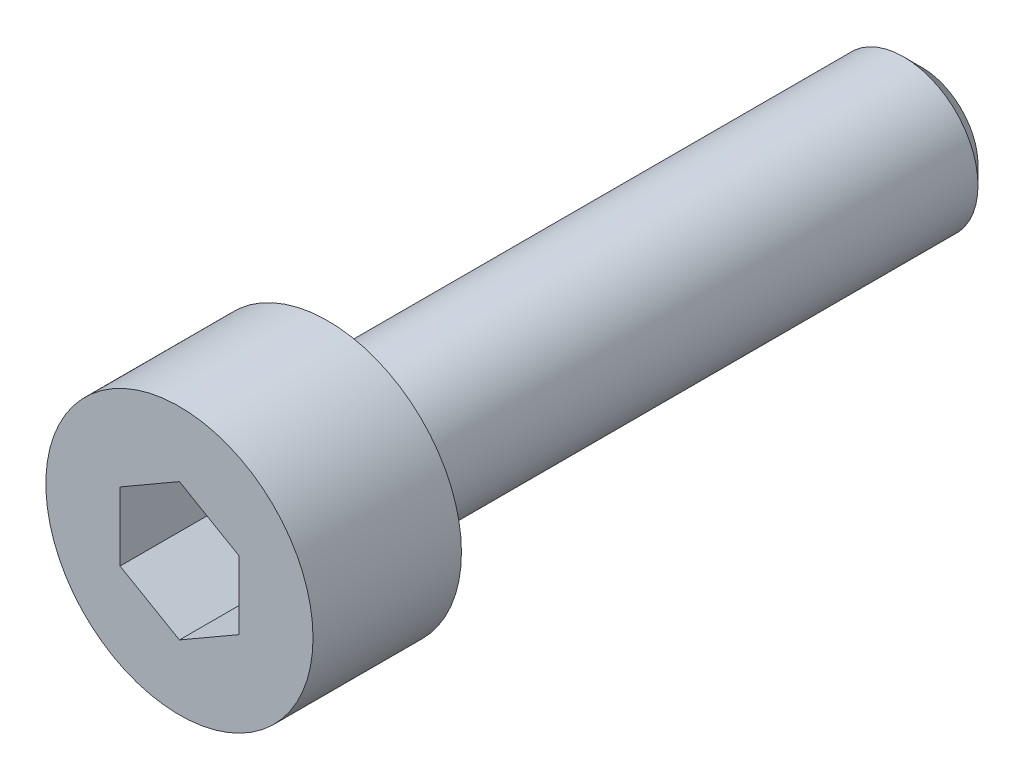
ISO-10303-21;
HEADER;
FILE_DESCRIPTION(('STEP AP214'),'2;1');
FILE_NAME('part.step','',(''),(''),'','','');
FILE_SCHEMA(('AUTOMOTIVE_DESIGN { 1 0 10303 214 1 1 1 1 }'));
ENDSEC;
DATA;
#1=APPLICATION_CONTEXT('core data for automotive mechanical design processes');
#2=APPLICATION_PROTOCOL_DEFINITION('international standard','automotive_design',2000,#1);
#3=PRODUCT_CONTEXT('',#1,'mechanical');
#4=PRODUCT('Part','Part','',(#3));
#5=PRODUCT_RELATED_PRODUCT_CATEGORY('part','',(#4));
#6=PRODUCT_DEFINITION_FORMATION('','',#4);
#7=PRODUCT_DEFINITION_CONTEXT('part definition',#1,'design');
#8=PRODUCT_DEFINITION('design','',#6,#7);
#9=PRODUCT_DEFINITION_SHAPE('','',#8);
#10=(LENGTH_UNIT() NAMED_UNIT(*) SI_UNIT(.MILLI.,.METRE.));
#11=(NAMED_UNIT(*) PLANE_ANGLE_UNIT() SI_UNIT($,.RADIAN.));
#12=(NAMED_UNIT(*) SI_UNIT($,.STERADIAN.) SOLID_ANGLE_UNIT());
#13=UNCERTAINTY_MEASURE_WITH_UNIT(LENGTH_MEASURE(1.E-05),#10,'distance_accuracy_value','');
#14=(GEOMETRIC_REPRESENTATION_CONTEXT(3) GLOBAL_UNCERTAINTY_ASSIGNED_CONTEXT((#13)) GLOBAL_UNIT_ASSIGNED_CONTEXT((#10,
#11,#12)) REPRESENTATION_CONTEXT('',''));
#15=CARTESIAN_POINT('',(0.,0.,0.));
#16=DIRECTION('',(0.,0.,1.));
#17=DIRECTION('',(1.,0.,0.));
#18=AXIS2_PLACEMENT_3D('',#15,#16,#17);
#19=CARTESIAN_POINT('',(0.,0.,0.));
#20=DIRECTION('',(0.,0.,1.));
#21=DIRECTION('',(1.,0.,0.));
#22=AXIS2_PLACEMENT_3D('',#19,#20,#21);
#23=PLANE('',#22);
#24=CARTESIAN_POINT('',(0.,0.,0.));
#25=DIRECTION('',(0.,0.,1.));
#26=DIRECTION('',(1.,0.,0.));
#27=AXIS2_PLACEMENT_3D('',#24,#25,#26);
#28=CIRCLE('',#27,2.25);
#29=CARTESIAN_POINT('',(2.25,0.,0.));
#30=VERTEX_POINT('',#29);
#31=EDGE_CURVE('E136',#30,#30,#28,.T.);
#32=ORIENTED_EDGE('',*,*,#31,.F.);
#33=EDGE_LOOP('',(#32));
#34=FACE_BOUND('',#33,.T.);
#35=CARTESIAN_POINT('',(0.,0.,0.));
#36=DIRECTION('',(0.,0.,1.));
#37=DIRECTION('',(1.,0.,0.));
#38=AXIS2_PLACEMENT_3D('',#35,#36,#37);
#39=CIRCLE('',#38,1.25);
#40=CARTESIAN_POINT('',(1.25,0.,0.));
#41=VERTEX_POINT('',#40);
#42=EDGE_CURVE('E145',#41,#41,#39,.F.);
#43=ORIENTED_EDGE('',*,*,#42,.F.);
#44=EDGE_LOOP('',(#43));
#45=FACE_BOUND('',#44,.T.);
#46=ADVANCED_FACE('F34',(#34,#45),#23,.F.);
#47=CARTESIAN_POINT('',(0.,0.,2.5));
#48=DIRECTION('',(0.,0.,-1.));
#49=DIRECTION('',(-1.,0.,0.));
#50=AXIS2_PLACEMENT_3D('',#47,#48,#49);
#51=CYLINDRICAL_SURFACE('',#50,2.25);
#52=CARTESIAN_POINT('',(0.,0.,2.5));
#53=DIRECTION('',(0.,0.,1.));
#54=DIRECTION('',(1.,0.,0.));
#55=AXIS2_PLACEMENT_3D('',#52,#53,#54);
#56=CIRCLE('',#55,2.25);
#57=CARTESIAN_POINT('',(2.25,0.,2.5));
#58=VERTEX_POINT('',#57);
#59=EDGE_CURVE('E142',#58,#58,#56,.T.);
#60=ORIENTED_EDGE('',*,*,#59,.F.);
#61=EDGE_LOOP('',(#60));
#62=FACE_BOUND('',#61,.T.);
#63=ORIENTED_EDGE('',*,*,#31,.T.);
#64=EDGE_LOOP('',(#63));
#65=FACE_BOUND('',#64,.T.);
#66=ADVANCED_FACE('F167',(#62,#65),#51,.T.);
#67=CARTESIAN_POINT('',(0.,0.,2.5));
#68=DIRECTION('',(0.,0.,1.));
#69=DIRECTION('',(1.,0.,0.));
#70=AXIS2_PLACEMENT_3D('',#67,#68,#69);
#71=PLANE('',#70);
#72=DIRECTION('',(-0.866025403784439,0.5,0.));
#73=VECTOR('',#72,1.);
#74=CARTESIAN_POINT('',(0.999999999999999,0.577350269189626,2.5));
#75=LINE('',#74,#73);
#76=CARTESIAN_POINT('',(0.999999999999999,0.577350269189626,2.5));
#77=VERTEX_POINT('',#76);
#78=CARTESIAN_POINT('',(0.,1.15470053837925,2.5));
#79=VERTEX_POINT('',#78);
#80=EDGE_CURVE('E49',#77,#79,#75,.T.);
#81=ORIENTED_EDGE('',*,*,#80,.F.);
#82=DIRECTION('',(0.,1.,0.));
#83=VECTOR('',#82,1.);
#84=CARTESIAN_POINT('',(0.999999999999999,-0.577350269189626,2.5));
#85=LINE('',#84,#83);
#86=CARTESIAN_POINT('',(0.999999999999999,-0.577350269189626,2.5));
#87=VERTEX_POINT('',#86);
#88=EDGE_CURVE('E132',#87,#77,#85,.T.);
#89=ORIENTED_EDGE('',*,*,#88,.F.);
#90=DIRECTION('',(0.866025403784439,0.5,0.));
#91=VECTOR('',#90,1.);
#92=CARTESIAN_POINT('',(0.,-1.15470053837925,2.5));
#93=LINE('',#92,#91);
#94=CARTESIAN_POINT('',(0.,-1.15470053837925,2.5));
#95=VERTEX_POINT('',#94);
#96=EDGE_CURVE('E130',#95,#87,#93,.T.);
#97=ORIENTED_EDGE('',*,*,#96,.F.);
#98=DIRECTION('',(0.866025403784438,-0.5,0.));
#99=VECTOR('',#98,1.);
#100=CARTESIAN_POINT('',(-1.,-0.577350269189626,2.5));
#101=LINE('',#100,#99);
#102=CARTESIAN_POINT('',(-1.,-0.577350269189626,2.5));
#103=VERTEX_POINT('',#102);
#104=EDGE_CURVE('E97',#103,#95,#101,.T.);
#105=ORIENTED_EDGE('',*,*,#104,.F.);
#106=DIRECTION('',(0.,-1.,0.));
#107=VECTOR('',#106,1.);
#108=CARTESIAN_POINT('',(-1.,0.577350269189626,2.5));
#109=LINE('',#108,#107);
#110=CARTESIAN_POINT('',(-1.,0.577350269189626,2.5));
#111=VERTEX_POINT('',#110);
#112=EDGE_CURVE('E126',#111,#103,#109,.T.);
#113=ORIENTED_EDGE('',*,*,#112,.F.);
#114=DIRECTION('',(-0.866025403784439,-0.5,0.));
#115=VECTOR('',#114,1.);
#116=CARTESIAN_POINT('',(0.,1.15470053837925,2.5));
#117=LINE('',#116,#115);
#118=EDGE_CURVE('E123',#79,#111,#117,.T.);
#119=ORIENTED_EDGE('',*,*,#118,.F.);
#120=EDGE_LOOP('',(#81,#89,#97,#105,#113,#119));
#121=FACE_BOUND('',#120,.T.);
#122=ORIENTED_EDGE('',*,*,#59,.T.);
#123=EDGE_LOOP('',(#122));
#124=FACE_BOUND('',#123,.T.);
#125=ADVANCED_FACE('F173',(#121,#124),#71,.T.);
#126=CARTESIAN_POINT('',(0.,0.,-10.));
#127=DIRECTION('',(0.,0.,1.));
#128=DIRECTION('',(1.,0.,0.));
#129=AXIS2_PLACEMENT_3D('',#126,#127,#128);
#130=CYLINDRICAL_SURFACE('',#129,1.25);
#131=CARTESIAN_POINT('',(0.,0.,-9.7));
#132=DIRECTION('',(0.,0.,-1.));
#133=DIRECTION('',(-1.,0.,0.));
#134=AXIS2_PLACEMENT_3D('',#131,#132,#133);
#135=CIRCLE('',#134,1.25);
#136=CARTESIAN_POINT('',(-1.25,0.,-9.7));
#137=VERTEX_POINT('',#136);
#138=EDGE_CURVE('E11',#137,#137,#135,.F.);
#139=ORIENTED_EDGE('',*,*,#138,.T.);
#140=EDGE_LOOP('',(#139));
#141=FACE_BOUND('',#140,.T.);
#142=ORIENTED_EDGE('',*,*,#42,.T.);
#143=EDGE_LOOP('',(#142));
#144=FACE_BOUND('',#143,.T.);
#145=ADVANCED_FACE('F163',(#141,#144),#130,.T.);
#146=CARTESIAN_POINT('',(0.,0.,-10.));
#147=DIRECTION('',(0.,0.,-1.));
#148=DIRECTION('',(-1.,0.,0.));
#149=AXIS2_PLACEMENT_3D('',#146,#147,#148);
#150=PLANE('',#149);
#151=CARTESIAN_POINT('',(0.,0.,-10.));
#152=DIRECTION('',(0.,0.,-1.));
#153=DIRECTION('',(-1.,0.,0.));
#154=AXIS2_PLACEMENT_3D('',#151,#152,#153);
#155=CIRCLE('',#154,0.950000000000001);
#156=CARTESIAN_POINT('',(-0.950000000000001,0.,-10.));
#157=VERTEX_POINT('',#156);
#158=EDGE_CURVE('E42',#157,#157,#155,.T.);
#159=ORIENTED_EDGE('',*,*,#158,.T.);
#160=EDGE_LOOP('',(#159));
#161=FACE_BOUND('',#160,.T.);
#162=ADVANCED_FACE('F152',(#161),#150,.T.);
#163=CARTESIAN_POINT('',(0.,0.,-10.));
#164=DIRECTION('',(0.,0.,1.));
#165=DIRECTION('',(1.,0.,0.));
#166=AXIS2_PLACEMENT_3D('',#163,#164,#165);
#167=CONICAL_SURFACE('',#166,0.950000000000001,0.785398163397449);
#168=ORIENTED_EDGE('',*,*,#138,.F.);
#169=EDGE_LOOP('',(#168));
#170=FACE_BOUND('',#169,.T.);
#171=ORIENTED_EDGE('',*,*,#158,.F.);
#172=EDGE_LOOP('',(#171));
#173=FACE_BOUND('',#172,.T.);
#174=ADVANCED_FACE('F36',(#170,#173),#167,.T.);
#175=CARTESIAN_POINT('',(0.999999999999999,0.577350269189626,0.5));
#176=DIRECTION('',(0.5,0.866025403784439,0.));
#177=DIRECTION('',(-0.866025403784439,0.5,0.));
#178=AXIS2_PLACEMENT_3D('',#175,#176,#177);
#179=PLANE('',#178);
#180=ORIENTED_EDGE('',*,*,#80,.T.);
#181=DIRECTION('',(0.,0.,1.));
#182=VECTOR('',#181,1.);
#183=CARTESIAN_POINT('',(0.,1.15470053837925,0.5));
#184=LINE('',#183,#182);
#185=CARTESIAN_POINT('',(0.,1.15470053837925,0.5));
#186=VERTEX_POINT('',#185);
#187=EDGE_CURVE('E79',#186,#79,#184,.T.);
#188=ORIENTED_EDGE('',*,*,#187,.F.);
#189=DIRECTION('',(-0.866025403784439,0.5,0.));
#190=VECTOR('',#189,1.);
#191=CARTESIAN_POINT('',(0.999999999999999,0.577350269189626,0.5));
#192=LINE('',#191,#190);
#193=CARTESIAN_POINT('',(0.999999999999999,0.577350269189626,0.5));
#194=VERTEX_POINT('',#193);
#195=EDGE_CURVE('E134',#194,#186,#192,.T.);
#196=ORIENTED_EDGE('',*,*,#195,.F.);
#197=DIRECTION('',(0.,0.,1.));
#198=VECTOR('',#197,1.);
#199=CARTESIAN_POINT('',(0.999999999999999,0.577350269189626,0.5));
#200=LINE('',#199,#198);
#201=EDGE_CURVE('E57',#194,#77,#200,.T.);
#202=ORIENTED_EDGE('',*,*,#201,.T.);
#203=EDGE_LOOP('',(#180,#188,#196,#202));
#204=FACE_BOUND('',#203,.T.);
#205=ADVANCED_FACE('F155',(#204),#179,.F.);
#206=CARTESIAN_POINT('',(0.999999999999999,-0.577350269189626,0.5));
#207=DIRECTION('',(1.,0.,0.));
#208=DIRECTION('',(0.,1.,0.));
#209=AXIS2_PLACEMENT_3D('',#206,#207,#208);
#210=PLANE('',#209);
#211=ORIENTED_EDGE('',*,*,#88,.T.);
#212=ORIENTED_EDGE('',*,*,#201,.F.);
#213=DIRECTION('',(0.,1.,0.));
#214=VECTOR('',#213,1.);
#215=CARTESIAN_POINT('',(0.999999999999999,-0.577350269189626,0.5));
#216=LINE('',#215,#214);
#217=CARTESIAN_POINT('',(0.999999999999999,-0.577350269189626,0.5));
#218=VERTEX_POINT('',#217);
#219=EDGE_CURVE('E109',#218,#194,#216,.T.);
#220=ORIENTED_EDGE('',*,*,#219,.F.);
#221=DIRECTION('',(0.,0.,1.));
#222=VECTOR('',#221,1.);
#223=CARTESIAN_POINT('',(0.999999999999999,-0.577350269189626,0.5));
#224=LINE('',#223,#222);
#225=EDGE_CURVE('E101',#218,#87,#224,.T.);
#226=ORIENTED_EDGE('',*,*,#225,.T.);
#227=EDGE_LOOP('',(#211,#212,#220,#226));
#228=FACE_BOUND('',#227,.T.);
#229=ADVANCED_FACE('F161',(#228),#210,.F.);
#230=CARTESIAN_POINT('',(0.,-1.15470053837925,0.5));
#231=DIRECTION('',(0.5,-0.866025403784439,0.));
#232=DIRECTION('',(0.866025403784439,0.5,0.));
#233=AXIS2_PLACEMENT_3D('',#230,#231,#232);
#234=PLANE('',#233);
#235=ORIENTED_EDGE('',*,*,#96,.T.);
#236=ORIENTED_EDGE('',*,*,#225,.F.);
#237=DIRECTION('',(0.866025403784439,0.5,0.));
#238=VECTOR('',#237,1.);
#239=CARTESIAN_POINT('',(0.,-1.15470053837925,0.5));
#240=LINE('',#239,#238);
#241=CARTESIAN_POINT('',(0.,-1.15470053837925,0.5));
#242=VERTEX_POINT('',#241);
#243=EDGE_CURVE('E105',#242,#218,#240,.T.);
#244=ORIENTED_EDGE('',*,*,#243,.F.);
#245=DIRECTION('',(0.,0.,1.));
#246=VECTOR('',#245,1.);
#247=CARTESIAN_POINT('',(0.,-1.15470053837925,0.5));
#248=LINE('',#247,#246);
#249=EDGE_CURVE('E90',#242,#95,#248,.T.);
#250=ORIENTED_EDGE('',*,*,#249,.T.);
#251=EDGE_LOOP('',(#235,#236,#244,#250));
#252=FACE_BOUND('',#251,.T.);
#253=ADVANCED_FACE('F106',(#252),#234,.F.);
#254=CARTESIAN_POINT('',(-1.,-0.577350269189626,0.5));
#255=DIRECTION('',(-0.5,-0.866025403784439,0.));
#256=DIRECTION('',(0.866025403784438,-0.5,0.));
#257=AXIS2_PLACEMENT_3D('',#254,#255,#256);
#258=PLANE('',#257);
#259=ORIENTED_EDGE('',*,*,#104,.T.);
#260=ORIENTED_EDGE('',*,*,#249,.F.);
#261=DIRECTION('',(0.866025403784438,-0.5,0.));
#262=VECTOR('',#261,1.);
#263=CARTESIAN_POINT('',(-1.,-0.577350269189626,0.5));
#264=LINE('',#263,#262);
#265=CARTESIAN_POINT('',(-1.,-0.577350269189626,0.5));
#266=VERTEX_POINT('',#265);
#267=EDGE_CURVE('E94',#266,#242,#264,.T.);
#268=ORIENTED_EDGE('',*,*,#267,.F.);
#269=DIRECTION('',(0.,0.,1.));
#270=VECTOR('',#269,1.);
#271=CARTESIAN_POINT('',(-1.,-0.577350269189626,0.5));
#272=LINE('',#271,#270);
#273=EDGE_CURVE('E102',#266,#103,#272,.T.);
#274=ORIENTED_EDGE('',*,*,#273,.T.);
#275=EDGE_LOOP('',(#259,#260,#268,#274));
#276=FACE_BOUND('',#275,.T.);
#277=ADVANCED_FACE('F92',(#276),#258,.F.);
#278=CARTESIAN_POINT('',(-1.,0.577350269189626,0.5));
#279=DIRECTION('',(-1.,0.,0.));
#280=DIRECTION('',(0.,0.,1.));
#281=AXIS2_PLACEMENT_3D('',#278,#279,#280);
#282=PLANE('',#281);
#283=ORIENTED_EDGE('',*,*,#112,.T.);
#284=ORIENTED_EDGE('',*,*,#273,.F.);
#285=DIRECTION('',(0.,-1.,0.));
#286=VECTOR('',#285,1.);
#287=CARTESIAN_POINT('',(-1.,0.577350269189626,0.5));
#288=LINE('',#287,#286);
#289=CARTESIAN_POINT('',(-1.,0.577350269189626,0.5));
#290=VERTEX_POINT('',#289);
#291=EDGE_CURVE('E115',#290,#266,#288,.T.);
#292=ORIENTED_EDGE('',*,*,#291,.F.);
#293=DIRECTION('',(0.,0.,1.));
#294=VECTOR('',#293,1.);
#295=CARTESIAN_POINT('',(-1.,0.577350269189626,0.5));
#296=LINE('',#295,#294);
#297=EDGE_CURVE('E139',#290,#111,#296,.T.);
#298=ORIENTED_EDGE('',*,*,#297,.T.);
#299=EDGE_LOOP('',(#283,#284,#292,#298));
#300=FACE_BOUND('',#299,.T.);
#301=ADVANCED_FACE('F187',(#300),#282,.F.);
#302=CARTESIAN_POINT('',(0.,1.15470053837925,0.5));
#303=DIRECTION('',(-0.5,0.866025403784439,0.));
#304=DIRECTION('',(-0.866025403784439,-0.5,0.));
#305=AXIS2_PLACEMENT_3D('',#302,#303,#304);
#306=PLANE('',#305);
#307=ORIENTED_EDGE('',*,*,#118,.T.);
#308=ORIENTED_EDGE('',*,*,#297,.F.);
#309=DIRECTION('',(-0.866025403784439,-0.5,0.));
#310=VECTOR('',#309,1.);
#311=CARTESIAN_POINT('',(0.,1.15470053837925,0.5));
#312=LINE('',#311,#310);
#313=EDGE_CURVE('E117',#186,#290,#312,.T.);
#314=ORIENTED_EDGE('',*,*,#313,.F.);
#315=ORIENTED_EDGE('',*,*,#187,.T.);
#316=EDGE_LOOP('',(#307,#308,#314,#315));
#317=FACE_BOUND('',#316,.T.);
#318=ADVANCED_FACE('F184',(#317),#306,.F.);
#319=CARTESIAN_POINT('',(0.,0.,0.5));
#320=DIRECTION('',(0.,0.,1.));
#321=DIRECTION('',(1.,0.,0.));
#322=AXIS2_PLACEMENT_3D('',#319,#320,#321);
#323=PLANE('',#322);
#324=ORIENTED_EDGE('',*,*,#195,.T.);
#325=ORIENTED_EDGE('',*,*,#313,.T.);
#326=ORIENTED_EDGE('',*,*,#291,.T.);
#327=ORIENTED_EDGE('',*,*,#267,.T.);
#328=ORIENTED_EDGE('',*,*,#243,.T.);
#329=ORIENTED_EDGE('',*,*,#219,.T.);
#330=EDGE_LOOP('',(#324,#325,#326,#327,#328,#329));
#331=FACE_BOUND('',#330,.T.);
#332=ADVANCED_FACE('F112',(#331),#323,.T.);
#333=CLOSED_SHELL('',(#46,#66,#125,#145,#162,#174,#205,#229,#253,#277,#301,#318,#332));
#334=MANIFOLD_SOLID_BREP('B2',#333);
#335=ADVANCED_BREP_SHAPE_REPRESENTATION('',(#18,#334),#14);
#336=SHAPE_DEFINITION_REPRESENTATION(#9,#335);
ENDSEC;
END-ISO-10303-21;
